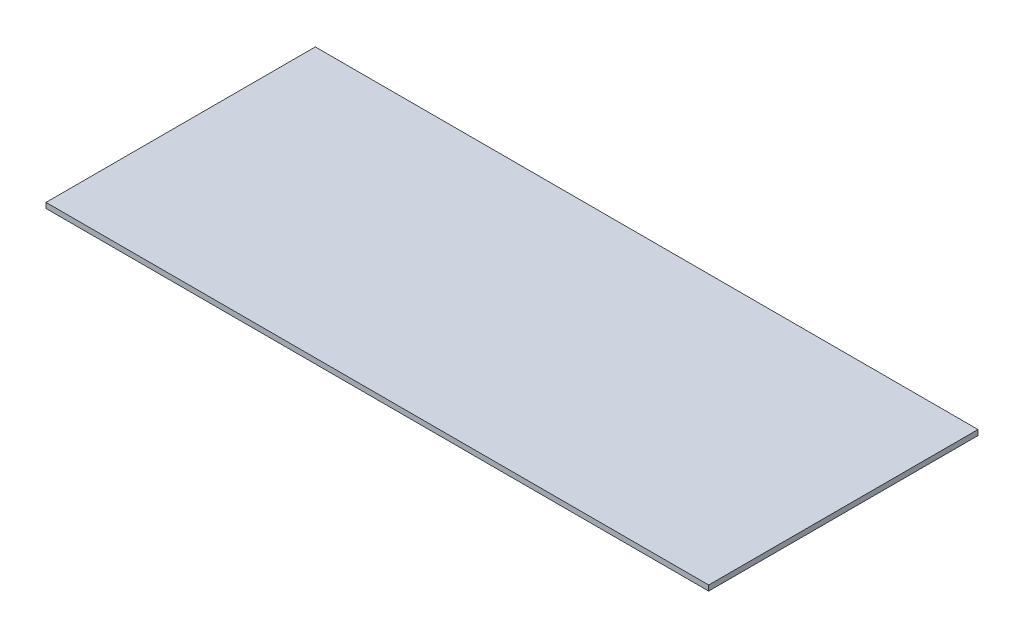
ISO-10303-21;
HEADER;
FILE_DESCRIPTION(('STEP AP214'),'2;1');
FILE_NAME('part.step','',(''),(''),'','','');
FILE_SCHEMA(('AUTOMOTIVE_DESIGN { 1 0 10303 214 1 1 1 1 }'));
ENDSEC;
DATA;
#1=APPLICATION_CONTEXT('core data for automotive mechanical design processes');
#2=APPLICATION_PROTOCOL_DEFINITION('international standard','automotive_design',2000,#1);
#3=PRODUCT_CONTEXT('',#1,'mechanical');
#4=PRODUCT('Part','Part','',(#3));
#5=PRODUCT_RELATED_PRODUCT_CATEGORY('part','',(#4));
#6=PRODUCT_DEFINITION_FORMATION('','',#4);
#7=PRODUCT_DEFINITION_CONTEXT('part definition',#1,'design');
#8=PRODUCT_DEFINITION('design','',#6,#7);
#9=PRODUCT_DEFINITION_SHAPE('','',#8);
#10=(LENGTH_UNIT() NAMED_UNIT(*) SI_UNIT(.MILLI.,.METRE.));
#11=(NAMED_UNIT(*) PLANE_ANGLE_UNIT() SI_UNIT($,.RADIAN.));
#12=(NAMED_UNIT(*) SI_UNIT($,.STERADIAN.) SOLID_ANGLE_UNIT());
#13=UNCERTAINTY_MEASURE_WITH_UNIT(LENGTH_MEASURE(1.E-05),#10,'distance_accuracy_value','');
#14=(GEOMETRIC_REPRESENTATION_CONTEXT(3) GLOBAL_UNCERTAINTY_ASSIGNED_CONTEXT((#13)) GLOBAL_UNIT_ASSIGNED_CONTEXT((#10,
#11,#12)) REPRESENTATION_CONTEXT('',''));
#15=CARTESIAN_POINT('',(0.,0.,0.));
#16=DIRECTION('',(0.,0.,1.));
#17=DIRECTION('',(1.,0.,0.));
#18=AXIS2_PLACEMENT_3D('',#15,#16,#17);
#19=CARTESIAN_POINT('',(125.,2.,-50.8));
#20=DIRECTION('',(-1.,0.,0.));
#21=DIRECTION('',(0.,0.,1.));
#22=AXIS2_PLACEMENT_3D('',#19,#20,#21);
#23=PLANE('',#22);
#24=DIRECTION('',(0.,0.,-1.));
#25=VECTOR('',#24,1.);
#26=CARTESIAN_POINT('',(125.,0.,-50.8));
#27=LINE('',#26,#25);
#28=CARTESIAN_POINT('',(125.,0.,50.8));
#29=VERTEX_POINT('',#28);
#30=CARTESIAN_POINT('',(125.,0.,-50.8));
#31=VERTEX_POINT('',#30);
#32=EDGE_CURVE('E113',#29,#31,#27,.T.);
#33=ORIENTED_EDGE('',*,*,#32,.T.);
#34=DIRECTION('',(0.,-1.,0.));
#35=VECTOR('',#34,1.);
#36=CARTESIAN_POINT('',(125.,2.,-50.8));
#37=LINE('',#36,#35);
#38=CARTESIAN_POINT('',(125.,2.,-50.8));
#39=VERTEX_POINT('',#38);
#40=EDGE_CURVE('E11',#39,#31,#37,.T.);
#41=ORIENTED_EDGE('',*,*,#40,.F.);
#42=DIRECTION('',(0.,0.,-1.));
#43=VECTOR('',#42,1.);
#44=CARTESIAN_POINT('',(125.,2.,-50.8));
#45=LINE('',#44,#43);
#46=CARTESIAN_POINT('',(125.,2.,50.8));
#47=VERTEX_POINT('',#46);
#48=EDGE_CURVE('E97',#47,#39,#45,.T.);
#49=ORIENTED_EDGE('',*,*,#48,.F.);
#50=DIRECTION('',(0.,-1.,0.));
#51=VECTOR('',#50,1.);
#52=CARTESIAN_POINT('',(125.,2.,50.8));
#53=LINE('',#52,#51);
#54=EDGE_CURVE('E109',#47,#29,#53,.T.);
#55=ORIENTED_EDGE('',*,*,#54,.T.);
#56=EDGE_LOOP('',(#33,#41,#49,#55));
#57=FACE_BOUND('',#56,.T.);
#58=ADVANCED_FACE('F45',(#57),#23,.F.);
#59=CARTESIAN_POINT('',(-125.,2.,-50.8));
#60=DIRECTION('',(0.,0.,1.));
#61=DIRECTION('',(1.,0.,0.));
#62=AXIS2_PLACEMENT_3D('',#59,#60,#61);
#63=PLANE('',#62);
#64=DIRECTION('',(-1.,0.,0.));
#65=VECTOR('',#64,1.);
#66=CARTESIAN_POINT('',(-125.,0.,-50.8));
#67=LINE('',#66,#65);
#68=CARTESIAN_POINT('',(-125.,0.,-50.8));
#69=VERTEX_POINT('',#68);
#70=EDGE_CURVE('E102',#31,#69,#67,.T.);
#71=ORIENTED_EDGE('',*,*,#70,.T.);
#72=DIRECTION('',(0.,-1.,0.));
#73=VECTOR('',#72,1.);
#74=CARTESIAN_POINT('',(-125.,2.,-50.8));
#75=LINE('',#74,#73);
#76=CARTESIAN_POINT('',(-125.,2.,-50.8));
#77=VERTEX_POINT('',#76);
#78=EDGE_CURVE('E54',#77,#69,#75,.T.);
#79=ORIENTED_EDGE('',*,*,#78,.F.);
#80=DIRECTION('',(-1.,0.,0.));
#81=VECTOR('',#80,1.);
#82=CARTESIAN_POINT('',(-125.,2.,-50.8));
#83=LINE('',#82,#81);
#84=EDGE_CURVE('E92',#39,#77,#83,.T.);
#85=ORIENTED_EDGE('',*,*,#84,.F.);
#86=ORIENTED_EDGE('',*,*,#40,.T.);
#87=EDGE_LOOP('',(#71,#79,#85,#86));
#88=FACE_BOUND('',#87,.T.);
#89=ADVANCED_FACE('F101',(#88),#63,.F.);
#90=CARTESIAN_POINT('',(-125.,2.,-50.8));
#91=DIRECTION('',(1.,0.,0.));
#92=DIRECTION('',(0.,0.,-1.));
#93=AXIS2_PLACEMENT_3D('',#90,#91,#92);
#94=PLANE('',#93);
#95=DIRECTION('',(0.,0.,1.));
#96=VECTOR('',#95,1.);
#97=CARTESIAN_POINT('',(-125.,0.,-50.8));
#98=LINE('',#97,#96);
#99=CARTESIAN_POINT('',(-125.,0.,50.8));
#100=VERTEX_POINT('',#99);
#101=EDGE_CURVE('E79',#69,#100,#98,.T.);
#102=ORIENTED_EDGE('',*,*,#101,.T.);
#103=DIRECTION('',(0.,-1.,0.));
#104=VECTOR('',#103,1.);
#105=CARTESIAN_POINT('',(-125.,2.,50.8));
#106=LINE('',#105,#104);
#107=CARTESIAN_POINT('',(-125.,2.,50.8));
#108=VERTEX_POINT('',#107);
#109=EDGE_CURVE('E104',#108,#100,#106,.T.);
#110=ORIENTED_EDGE('',*,*,#109,.F.);
#111=DIRECTION('',(0.,0.,1.));
#112=VECTOR('',#111,1.);
#113=CARTESIAN_POINT('',(-125.,2.,-50.8));
#114=LINE('',#113,#112);
#115=EDGE_CURVE('E95',#77,#108,#114,.T.);
#116=ORIENTED_EDGE('',*,*,#115,.F.);
#117=ORIENTED_EDGE('',*,*,#78,.T.);
#118=EDGE_LOOP('',(#102,#110,#116,#117));
#119=FACE_BOUND('',#118,.T.);
#120=ADVANCED_FACE('F105',(#119),#94,.F.);
#121=CARTESIAN_POINT('',(-125.,2.,50.8));
#122=DIRECTION('',(0.,0.,-1.));
#123=DIRECTION('',(-1.,0.,0.));
#124=AXIS2_PLACEMENT_3D('',#121,#122,#123);
#125=PLANE('',#124);
#126=DIRECTION('',(1.,0.,0.));
#127=VECTOR('',#126,1.);
#128=CARTESIAN_POINT('',(-125.,0.,50.8));
#129=LINE('',#128,#127);
#130=EDGE_CURVE('E85',#100,#29,#129,.T.);
#131=ORIENTED_EDGE('',*,*,#130,.T.);
#132=ORIENTED_EDGE('',*,*,#54,.F.);
#133=DIRECTION('',(1.,0.,0.));
#134=VECTOR('',#133,1.);
#135=CARTESIAN_POINT('',(-125.,2.,50.8));
#136=LINE('',#135,#134);
#137=EDGE_CURVE('E62',#108,#47,#136,.T.);
#138=ORIENTED_EDGE('',*,*,#137,.F.);
#139=ORIENTED_EDGE('',*,*,#109,.T.);
#140=EDGE_LOOP('',(#131,#132,#138,#139));
#141=FACE_BOUND('',#140,.T.);
#142=ADVANCED_FACE('F126',(#141),#125,.F.);
#143=CARTESIAN_POINT('',(0.,2.,0.));
#144=DIRECTION('',(0.,1.,0.));
#145=DIRECTION('',(0.,0.,1.));
#146=AXIS2_PLACEMENT_3D('',#143,#144,#145);
#147=PLANE('',#146);
#148=ORIENTED_EDGE('',*,*,#48,.T.);
#149=ORIENTED_EDGE('',*,*,#84,.T.);
#150=ORIENTED_EDGE('',*,*,#115,.T.);
#151=ORIENTED_EDGE('',*,*,#137,.T.);
#152=EDGE_LOOP('',(#148,#149,#150,#151));
#153=FACE_BOUND('',#152,.T.);
#154=ADVANCED_FACE('F93',(#153),#147,.T.);
#155=CARTESIAN_POINT('',(0.,0.,0.));
#156=DIRECTION('',(0.,1.,0.));
#157=DIRECTION('',(0.,0.,1.));
#158=AXIS2_PLACEMENT_3D('',#155,#156,#157);
#159=PLANE('',#158);
#160=ORIENTED_EDGE('',*,*,#32,.F.);
#161=ORIENTED_EDGE('',*,*,#130,.F.);
#162=ORIENTED_EDGE('',*,*,#101,.F.);
#163=ORIENTED_EDGE('',*,*,#70,.F.);
#164=EDGE_LOOP('',(#160,#161,#162,#163));
#165=FACE_BOUND('',#164,.T.);
#166=ADVANCED_FACE('F129',(#165),#159,.F.);
#167=CLOSED_SHELL('',(#58,#89,#120,#142,#154,#166));
#168=MANIFOLD_SOLID_BREP('B2',#167);
#169=ADVANCED_BREP_SHAPE_REPRESENTATION('',(#18,#168),#14);
#170=SHAPE_DEFINITION_REPRESENTATION(#9,#169);
ENDSEC;
END-ISO-10303-21;
